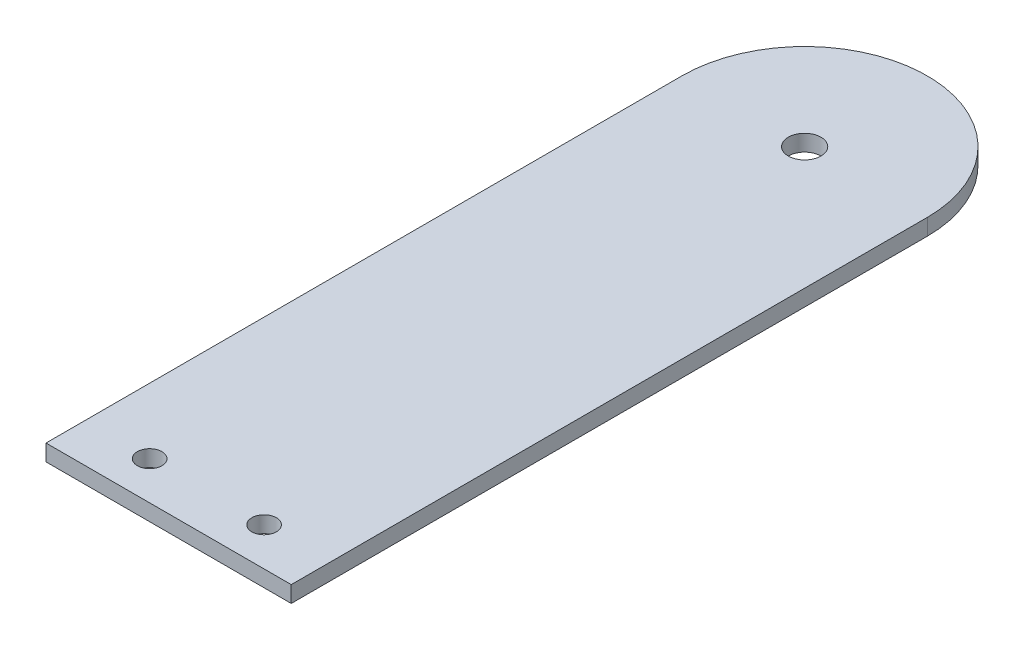
ISO-10303-21;
HEADER;
FILE_DESCRIPTION(('STEP AP214'),'2;1');
FILE_NAME('part.step','',(''),(''),'','','');
FILE_SCHEMA(('AUTOMOTIVE_DESIGN { 1 0 10303 214 1 1 1 1 }'));
ENDSEC;
DATA;
#1=APPLICATION_CONTEXT('core data for automotive mechanical design processes');
#2=APPLICATION_PROTOCOL_DEFINITION('international standard','automotive_design',2000,#1);
#3=PRODUCT_CONTEXT('',#1,'mechanical');
#4=PRODUCT('Part','Part','',(#3));
#5=PRODUCT_RELATED_PRODUCT_CATEGORY('part','',(#4));
#6=PRODUCT_DEFINITION_FORMATION('','',#4);
#7=PRODUCT_DEFINITION_CONTEXT('part definition',#1,'design');
#8=PRODUCT_DEFINITION('design','',#6,#7);
#9=PRODUCT_DEFINITION_SHAPE('','',#8);
#10=(LENGTH_UNIT() NAMED_UNIT(*) SI_UNIT(.MILLI.,.METRE.));
#11=(NAMED_UNIT(*) PLANE_ANGLE_UNIT() SI_UNIT($,.RADIAN.));
#12=(NAMED_UNIT(*) SI_UNIT($,.STERADIAN.) SOLID_ANGLE_UNIT());
#13=UNCERTAINTY_MEASURE_WITH_UNIT(LENGTH_MEASURE(1.E-05),#10,'distance_accuracy_value','');
#14=(GEOMETRIC_REPRESENTATION_CONTEXT(3) GLOBAL_UNCERTAINTY_ASSIGNED_CONTEXT((#13)) GLOBAL_UNIT_ASSIGNED_CONTEXT((#10,
#11,#12)) REPRESENTATION_CONTEXT('',''));
#15=CARTESIAN_POINT('',(0.,0.,0.));
#16=DIRECTION('',(0.,0.,1.));
#17=DIRECTION('',(1.,0.,0.));
#18=AXIS2_PLACEMENT_3D('',#15,#16,#17);
#19=CARTESIAN_POINT('',(-2.62522791540278,2.,-48.1827211912994));
#20=DIRECTION('',(0.,1.,0.));
#21=DIRECTION('',(0.,0.,1.));
#22=AXIS2_PLACEMENT_3D('',#19,#20,#21);
#23=PLANE('',#22);
#24=CARTESIAN_POINT('',(4.37477208459723,2.,24.9379456374754));
#25=DIRECTION('',(0.,1.,0.));
#26=DIRECTION('',(0.,0.,1.));
#27=AXIS2_PLACEMENT_3D('',#24,#25,#26);
#28=CIRCLE('',#27,1.5);
#29=CARTESIAN_POINT('',(4.37477208459723,2.,26.4379456374754));
#30=VERTEX_POINT('',#29);
#31=EDGE_CURVE('E117',#30,#30,#28,.T.);
#32=ORIENTED_EDGE('',*,*,#31,.F.);
#33=EDGE_LOOP('',(#32));
#34=FACE_BOUND('',#33,.T.);
#35=DIRECTION('',(0.,0.,1.));
#36=VECTOR('',#35,1.);
#37=CARTESIAN_POINT('',(-17.6252279154028,2.,29.6172788087006));
#38=LINE('',#37,#36);
#39=CARTESIAN_POINT('',(-17.6252279154028,2.,-48.1827211912994));
#40=VERTEX_POINT('',#39);
#41=CARTESIAN_POINT('',(-17.6252279154028,2.,29.6172788087006));
#42=VERTEX_POINT('',#41);
#43=EDGE_CURVE('E87',#40,#42,#38,.T.);
#44=ORIENTED_EDGE('',*,*,#43,.T.);
#45=DIRECTION('',(1.,0.,0.));
#46=VECTOR('',#45,1.);
#47=CARTESIAN_POINT('',(-17.6252279154028,2.,29.6172788087006));
#48=LINE('',#47,#46);
#49=CARTESIAN_POINT('',(12.3747720845972,2.,29.6172788087006));
#50=VERTEX_POINT('',#49);
#51=EDGE_CURVE('E82',#42,#50,#48,.T.);
#52=ORIENTED_EDGE('',*,*,#51,.T.);
#53=DIRECTION('',(0.,0.,-1.));
#54=VECTOR('',#53,1.);
#55=CARTESIAN_POINT('',(12.3747720845972,2.,29.6172788087006));
#56=LINE('',#55,#54);
#57=CARTESIAN_POINT('',(12.3747720845972,2.,-48.1827211912994));
#58=VERTEX_POINT('',#57);
#59=EDGE_CURVE('E85',#50,#58,#56,.T.);
#60=ORIENTED_EDGE('',*,*,#59,.T.);
#61=CARTESIAN_POINT('',(-2.62522791540278,2.,-48.1827211912994));
#62=DIRECTION('',(0.,1.,0.));
#63=DIRECTION('',(0.,0.,1.));
#64=AXIS2_PLACEMENT_3D('',#61,#62,#63);
#65=CIRCLE('',#64,15.);
#66=EDGE_CURVE('E52',#58,#40,#65,.T.);
#67=ORIENTED_EDGE('',*,*,#66,.T.);
#68=EDGE_LOOP('',(#44,#52,#60,#67));
#69=FACE_BOUND('',#68,.T.);
#70=CARTESIAN_POINT('',(-9.62522791540277,2.,24.9379456374754));
#71=DIRECTION('',(0.,1.,0.));
#72=DIRECTION('',(0.,0.,1.));
#73=AXIS2_PLACEMENT_3D('',#70,#71,#72);
#74=CIRCLE('',#73,1.5);
#75=CARTESIAN_POINT('',(-9.62522791540277,2.,26.4379456374754));
#76=VERTEX_POINT('',#75);
#77=EDGE_CURVE('E102',#76,#76,#74,.T.);
#78=ORIENTED_EDGE('',*,*,#77,.F.);
#79=EDGE_LOOP('',(#78));
#80=FACE_BOUND('',#79,.T.);
#81=CARTESIAN_POINT('',(-2.62522791540278,2.,-48.1827211912994));
#82=DIRECTION('',(0.,1.,0.));
#83=DIRECTION('',(0.,0.,1.));
#84=AXIS2_PLACEMENT_3D('',#81,#82,#83);
#85=CIRCLE('',#84,2.);
#86=CARTESIAN_POINT('',(-2.62522791540278,2.,-46.1827211912994));
#87=VERTEX_POINT('',#86);
#88=EDGE_CURVE('E123',#87,#87,#85,.T.);
#89=ORIENTED_EDGE('',*,*,#88,.F.);
#90=EDGE_LOOP('',(#89));
#91=FACE_BOUND('',#90,.T.);
#92=ADVANCED_FACE('F35',(#34,#69,#80,#91),#23,.T.);
#93=CARTESIAN_POINT('',(-2.62522791540278,0.,-48.1827211912994));
#94=DIRECTION('',(0.,1.,0.));
#95=DIRECTION('',(0.,0.,1.));
#96=AXIS2_PLACEMENT_3D('',#93,#94,#95);
#97=PLANE('',#96);
#98=DIRECTION('',(0.,0.,1.));
#99=VECTOR('',#98,1.);
#100=CARTESIAN_POINT('',(-17.6252279154028,0.,29.6172788087006));
#101=LINE('',#100,#99);
#102=CARTESIAN_POINT('',(-17.6252279154028,0.,-48.1827211912994));
#103=VERTEX_POINT('',#102);
#104=CARTESIAN_POINT('',(-17.6252279154028,0.,29.6172788087006));
#105=VERTEX_POINT('',#104);
#106=EDGE_CURVE('E99',#103,#105,#101,.T.);
#107=ORIENTED_EDGE('',*,*,#106,.F.);
#108=CARTESIAN_POINT('',(-2.62522791540278,0.,-48.1827211912994));
#109=DIRECTION('',(0.,1.,0.));
#110=DIRECTION('',(0.,0.,1.));
#111=AXIS2_PLACEMENT_3D('',#108,#109,#110);
#112=CIRCLE('',#111,15.);
#113=CARTESIAN_POINT('',(12.3747720845972,0.,-48.1827211912994));
#114=VERTEX_POINT('',#113);
#115=EDGE_CURVE('E75',#114,#103,#112,.T.);
#116=ORIENTED_EDGE('',*,*,#115,.F.);
#117=DIRECTION('',(0.,0.,-1.));
#118=VECTOR('',#117,1.);
#119=CARTESIAN_POINT('',(12.3747720845972,0.,29.6172788087006));
#120=LINE('',#119,#118);
#121=CARTESIAN_POINT('',(12.3747720845972,0.,29.6172788087006));
#122=VERTEX_POINT('',#121);
#123=EDGE_CURVE('E69',#122,#114,#120,.T.);
#124=ORIENTED_EDGE('',*,*,#123,.F.);
#125=DIRECTION('',(1.,0.,0.));
#126=VECTOR('',#125,1.);
#127=CARTESIAN_POINT('',(-17.6252279154028,0.,29.6172788087006));
#128=LINE('',#127,#126);
#129=EDGE_CURVE('E91',#105,#122,#128,.T.);
#130=ORIENTED_EDGE('',*,*,#129,.F.);
#131=EDGE_LOOP('',(#107,#116,#124,#130));
#132=FACE_BOUND('',#131,.T.);
#133=CARTESIAN_POINT('',(-9.62522791540277,0.,24.9379456374754));
#134=DIRECTION('',(0.,1.,0.));
#135=DIRECTION('',(0.,0.,1.));
#136=AXIS2_PLACEMENT_3D('',#133,#134,#135);
#137=CIRCLE('',#136,1.5);
#138=CARTESIAN_POINT('',(-9.62522791540277,0.,26.4379456374754));
#139=VERTEX_POINT('',#138);
#140=EDGE_CURVE('E114',#139,#139,#137,.T.);
#141=ORIENTED_EDGE('',*,*,#140,.T.);
#142=EDGE_LOOP('',(#141));
#143=FACE_BOUND('',#142,.T.);
#144=CARTESIAN_POINT('',(4.37477208459723,0.,24.9379456374754));
#145=DIRECTION('',(0.,1.,0.));
#146=DIRECTION('',(0.,0.,1.));
#147=AXIS2_PLACEMENT_3D('',#144,#145,#146);
#148=CIRCLE('',#147,1.5);
#149=CARTESIAN_POINT('',(4.37477208459723,0.,26.4379456374754));
#150=VERTEX_POINT('',#149);
#151=EDGE_CURVE('E120',#150,#150,#148,.T.);
#152=ORIENTED_EDGE('',*,*,#151,.T.);
#153=EDGE_LOOP('',(#152));
#154=FACE_BOUND('',#153,.T.);
#155=CARTESIAN_POINT('',(-2.62522791540278,0.,-48.1827211912994));
#156=DIRECTION('',(0.,1.,0.));
#157=DIRECTION('',(0.,0.,1.));
#158=AXIS2_PLACEMENT_3D('',#155,#156,#157);
#159=CIRCLE('',#158,2.);
#160=CARTESIAN_POINT('',(-2.62522791540278,0.,-46.1827211912994));
#161=VERTEX_POINT('',#160);
#162=EDGE_CURVE('E126',#161,#161,#159,.T.);
#163=ORIENTED_EDGE('',*,*,#162,.T.);
#164=EDGE_LOOP('',(#163));
#165=FACE_BOUND('',#164,.T.);
#166=ADVANCED_FACE('F110',(#132,#143,#154,#165),#97,.F.);
#167=CARTESIAN_POINT('',(-17.6252279154028,2.,29.6172788087006));
#168=DIRECTION('',(1.,0.,0.));
#169=DIRECTION('',(0.,0.,-1.));
#170=AXIS2_PLACEMENT_3D('',#167,#168,#169);
#171=PLANE('',#170);
#172=ORIENTED_EDGE('',*,*,#106,.T.);
#173=DIRECTION('',(0.,-1.,0.));
#174=VECTOR('',#173,1.);
#175=CARTESIAN_POINT('',(-17.6252279154028,2.,29.6172788087006));
#176=LINE('',#175,#174);
#177=EDGE_CURVE('E11',#42,#105,#176,.T.);
#178=ORIENTED_EDGE('',*,*,#177,.F.);
#179=ORIENTED_EDGE('',*,*,#43,.F.);
#180=DIRECTION('',(0.,-1.,0.));
#181=VECTOR('',#180,1.);
#182=CARTESIAN_POINT('',(-17.6252279154028,2.,-48.1827211912994));
#183=LINE('',#182,#181);
#184=EDGE_CURVE('E95',#40,#103,#183,.T.);
#185=ORIENTED_EDGE('',*,*,#184,.T.);
#186=EDGE_LOOP('',(#172,#178,#179,#185));
#187=FACE_BOUND('',#186,.T.);
#188=ADVANCED_FACE('F37',(#187),#171,.F.);
#189=CARTESIAN_POINT('',(-17.6252279154028,2.,29.6172788087006));
#190=DIRECTION('',(0.,0.,-1.));
#191=DIRECTION('',(-1.,0.,0.));
#192=AXIS2_PLACEMENT_3D('',#189,#190,#191);
#193=PLANE('',#192);
#194=ORIENTED_EDGE('',*,*,#129,.T.);
#195=DIRECTION('',(0.,-1.,0.));
#196=VECTOR('',#195,1.);
#197=CARTESIAN_POINT('',(12.3747720845972,2.,29.6172788087006));
#198=LINE('',#197,#196);
#199=EDGE_CURVE('E44',#50,#122,#198,.T.);
#200=ORIENTED_EDGE('',*,*,#199,.F.);
#201=ORIENTED_EDGE('',*,*,#51,.F.);
#202=ORIENTED_EDGE('',*,*,#177,.T.);
#203=EDGE_LOOP('',(#194,#200,#201,#202));
#204=FACE_BOUND('',#203,.T.);
#205=ADVANCED_FACE('F90',(#204),#193,.F.);
#206=CARTESIAN_POINT('',(12.3747720845972,2.,29.6172788087006));
#207=DIRECTION('',(-1.,0.,0.));
#208=DIRECTION('',(0.,0.,1.));
#209=AXIS2_PLACEMENT_3D('',#206,#207,#208);
#210=PLANE('',#209);
#211=ORIENTED_EDGE('',*,*,#123,.T.);
#212=DIRECTION('',(0.,-1.,0.));
#213=VECTOR('',#212,1.);
#214=CARTESIAN_POINT('',(12.3747720845972,2.,-48.1827211912994));
#215=LINE('',#214,#213);
#216=EDGE_CURVE('E92',#58,#114,#215,.T.);
#217=ORIENTED_EDGE('',*,*,#216,.F.);
#218=ORIENTED_EDGE('',*,*,#59,.F.);
#219=ORIENTED_EDGE('',*,*,#199,.T.);
#220=EDGE_LOOP('',(#211,#217,#218,#219));
#221=FACE_BOUND('',#220,.T.);
#222=ADVANCED_FACE('F93',(#221),#210,.F.);
#223=CARTESIAN_POINT('',(-2.62522791540278,2.,-48.1827211912994));
#224=DIRECTION('',(0.,-1.,0.));
#225=DIRECTION('',(0.,0.,-1.));
#226=AXIS2_PLACEMENT_3D('',#223,#224,#225);
#227=CYLINDRICAL_SURFACE('',#226,15.);
#228=ORIENTED_EDGE('',*,*,#115,.T.);
#229=ORIENTED_EDGE('',*,*,#184,.F.);
#230=ORIENTED_EDGE('',*,*,#66,.F.);
#231=ORIENTED_EDGE('',*,*,#216,.T.);
#232=EDGE_LOOP('',(#228,#229,#230,#231));
#233=FACE_BOUND('',#232,.T.);
#234=ADVANCED_FACE('F107',(#233),#227,.T.);
#235=CARTESIAN_POINT('',(-9.62522791540277,2.,24.9379456374754));
#236=DIRECTION('',(0.,-1.,0.));
#237=DIRECTION('',(0.,0.,-1.));
#238=AXIS2_PLACEMENT_3D('',#235,#236,#237);
#239=CYLINDRICAL_SURFACE('',#238,1.5);
#240=ORIENTED_EDGE('',*,*,#77,.T.);
#241=EDGE_LOOP('',(#240));
#242=FACE_BOUND('',#241,.T.);
#243=ORIENTED_EDGE('',*,*,#140,.F.);
#244=EDGE_LOOP('',(#243));
#245=FACE_BOUND('',#244,.T.);
#246=ADVANCED_FACE('F144',(#242,#245),#239,.F.);
#247=CARTESIAN_POINT('',(4.37477208459723,2.,24.9379456374754));
#248=DIRECTION('',(0.,-1.,0.));
#249=DIRECTION('',(0.,0.,-1.));
#250=AXIS2_PLACEMENT_3D('',#247,#248,#249);
#251=CYLINDRICAL_SURFACE('',#250,1.5);
#252=ORIENTED_EDGE('',*,*,#31,.T.);
#253=EDGE_LOOP('',(#252));
#254=FACE_BOUND('',#253,.T.);
#255=ORIENTED_EDGE('',*,*,#151,.F.);
#256=EDGE_LOOP('',(#255));
#257=FACE_BOUND('',#256,.T.);
#258=ADVANCED_FACE('F190',(#254,#257),#251,.F.);
#259=CARTESIAN_POINT('',(-2.62522791540278,2.,-48.1827211912994));
#260=DIRECTION('',(0.,-1.,0.));
#261=DIRECTION('',(0.,0.,-1.));
#262=AXIS2_PLACEMENT_3D('',#259,#260,#261);
#263=CYLINDRICAL_SURFACE('',#262,2.);
#264=ORIENTED_EDGE('',*,*,#88,.T.);
#265=EDGE_LOOP('',(#264));
#266=FACE_BOUND('',#265,.T.);
#267=ORIENTED_EDGE('',*,*,#162,.F.);
#268=EDGE_LOOP('',(#267));
#269=FACE_BOUND('',#268,.T.);
#270=ADVANCED_FACE('F132',(#266,#269),#263,.F.);
#271=CLOSED_SHELL('',(#92,#166,#188,#205,#222,#234,#246,#258,#270));
#272=MANIFOLD_SOLID_BREP('B2',#271);
#273=ADVANCED_BREP_SHAPE_REPRESENTATION('',(#18,#272),#14);
#274=SHAPE_DEFINITION_REPRESENTATION(#9,#273);
ENDSEC;
END-ISO-10303-21;
